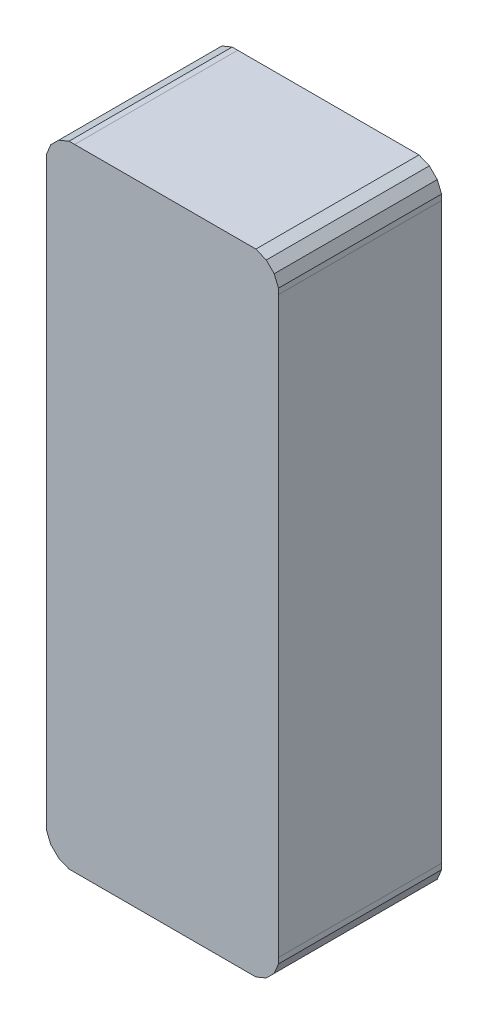
ISO-10303-21;
HEADER;
FILE_DESCRIPTION(('STEP AP214'),'2;1');
FILE_NAME('part.step','',(''),(''),'','','');
FILE_SCHEMA(('AUTOMOTIVE_DESIGN { 1 0 10303 214 1 1 1 1 }'));
ENDSEC;
DATA;
#1=APPLICATION_CONTEXT('core data for automotive mechanical design processes');
#2=APPLICATION_PROTOCOL_DEFINITION('international standard','automotive_design',2000,#1);
#3=PRODUCT_CONTEXT('',#1,'mechanical');
#4=PRODUCT('Part','Part','',(#3));
#5=PRODUCT_RELATED_PRODUCT_CATEGORY('part','',(#4));
#6=PRODUCT_DEFINITION_FORMATION('','',#4);
#7=PRODUCT_DEFINITION_CONTEXT('part definition',#1,'design');
#8=PRODUCT_DEFINITION('design','',#6,#7);
#9=PRODUCT_DEFINITION_SHAPE('','',#8);
#10=(LENGTH_UNIT() NAMED_UNIT(*) SI_UNIT(.MILLI.,.METRE.));
#11=(NAMED_UNIT(*) PLANE_ANGLE_UNIT() SI_UNIT($,.RADIAN.));
#12=(NAMED_UNIT(*) SI_UNIT($,.STERADIAN.) SOLID_ANGLE_UNIT());
#13=UNCERTAINTY_MEASURE_WITH_UNIT(LENGTH_MEASURE(1.E-05),#10,'distance_accuracy_value','');
#14=(GEOMETRIC_REPRESENTATION_CONTEXT(3) GLOBAL_UNCERTAINTY_ASSIGNED_CONTEXT((#13)) GLOBAL_UNIT_ASSIGNED_CONTEXT((#10,
#11,#12)) REPRESENTATION_CONTEXT('',''));
#15=CARTESIAN_POINT('',(0.,0.,0.));
#16=DIRECTION('',(0.,0.,1.));
#17=DIRECTION('',(1.,0.,0.));
#18=AXIS2_PLACEMENT_3D('',#15,#16,#17);
#19=CARTESIAN_POINT('',(24.229618583984,18.28157222,1.000000596046));
#20=DIRECTION('',(0.707106781187048,0.707106781186048,0.));
#21=DIRECTION('',(-0.707106781186048,0.707106781187048,0.));
#22=AXIS2_PLACEMENT_3D('',#19,#20,#21);
#23=PLANE('',#22);
#24=DIRECTION('',(0.,0.,1.));
#25=VECTOR('',#24,1.);
#26=CARTESIAN_POINT('',(24.356059783984,18.15513102,1.000000596046));
#27=LINE('',#26,#25);
#28=CARTESIAN_POINT('',(24.356059783984,18.15513102,1.000000596046));
#29=VERTEX_POINT('',#28);
#30=CARTESIAN_POINT('',(24.356059783984,18.15513102,3.600000476046));
#31=VERTEX_POINT('',#30);
#32=EDGE_CURVE('E180',#29,#31,#27,.T.);
#33=ORIENTED_EDGE('',*,*,#32,.F.);
#34=DIRECTION('',(-0.707106781186048,0.707106781187048,0.));
#35=VECTOR('',#34,1.);
#36=CARTESIAN_POINT('',(24.229618583984,18.28157222,1.000000596046));
#37=LINE('',#36,#35);
#38=CARTESIAN_POINT('',(24.229618583984,18.28157222,1.000000596046));
#39=VERTEX_POINT('',#38);
#40=EDGE_CURVE('E186',#29,#39,#37,.T.);
#41=ORIENTED_EDGE('',*,*,#40,.T.);
#42=DIRECTION('',(0.,0.,1.));
#43=VECTOR('',#42,1.);
#44=CARTESIAN_POINT('',(24.229618583984,18.28157222,1.000000596046));
#45=LINE('',#44,#43);
#46=CARTESIAN_POINT('',(24.229618583984,18.28157222,3.600000476046));
#47=VERTEX_POINT('',#46);
#48=EDGE_CURVE('E183',#47,#39,#45,.F.);
#49=ORIENTED_EDGE('',*,*,#48,.F.);
#50=DIRECTION('',(-0.707106781186048,0.707106781187048,0.));
#51=VECTOR('',#50,1.);
#52=CARTESIAN_POINT('',(24.229618583984,18.28157222,3.600000476046));
#53=LINE('',#52,#51);
#54=EDGE_CURVE('E177',#47,#31,#53,.F.);
#55=ORIENTED_EDGE('',*,*,#54,.T.);
#56=EDGE_LOOP('',(#33,#41,#49,#55));
#57=FACE_BOUND('',#56,.T.);
#58=ADVANCED_FACE('F17',(#57),#23,.T.);
#59=CARTESIAN_POINT('',(24.356184243984,8.4951986,1.000000596046));
#60=DIRECTION('',(0.707468684903795,-0.706744692148795,0.));
#61=DIRECTION('',(0.706744692148795,0.707468684903795,0.));
#62=AXIS2_PLACEMENT_3D('',#59,#60,#61);
#63=PLANE('',#62);
#64=DIRECTION('',(0.,0.,1.));
#65=VECTOR('',#64,1.);
#66=CARTESIAN_POINT('',(24.229730343984,8.36861516,1.000000596046));
#67=LINE('',#66,#65);
#68=CARTESIAN_POINT('',(24.229730343984,8.36861515999999,1.000000596046));
#69=VERTEX_POINT('',#68);
#70=CARTESIAN_POINT('',(24.229730343984,8.36861515999999,3.600000476046));
#71=VERTEX_POINT('',#70);
#72=EDGE_CURVE('E374',#69,#71,#67,.T.);
#73=ORIENTED_EDGE('',*,*,#72,.F.);
#74=DIRECTION('',(0.706744692148795,0.707468684903795,0.));
#75=VECTOR('',#74,1.);
#76=CARTESIAN_POINT('',(24.356184243984,8.4951986,1.000000596046));
#77=LINE('',#76,#75);
#78=CARTESIAN_POINT('',(24.356184243984,8.49519859999999,1.000000596046));
#79=VERTEX_POINT('',#78);
#80=EDGE_CURVE('E371',#69,#79,#77,.T.);
#81=ORIENTED_EDGE('',*,*,#80,.T.);
#82=DIRECTION('',(0.,0.,1.));
#83=VECTOR('',#82,1.);
#84=CARTESIAN_POINT('',(24.356184243984,8.49519859999998,1.000000596046));
#85=LINE('',#84,#83);
#86=CARTESIAN_POINT('',(24.356184243984,8.49519859999999,3.600000476046));
#87=VERTEX_POINT('',#86);
#88=EDGE_CURVE('E386',#87,#79,#85,.F.);
#89=ORIENTED_EDGE('',*,*,#88,.F.);
#90=DIRECTION('',(0.706744692148795,0.707468684903795,0.));
#91=VECTOR('',#90,1.);
#92=CARTESIAN_POINT('',(24.356184243984,8.4951986,3.600000476046));
#93=LINE('',#92,#91);
#94=EDGE_CURVE('E209',#87,#71,#93,.F.);
#95=ORIENTED_EDGE('',*,*,#94,.T.);
#96=EDGE_LOOP('',(#73,#81,#89,#95));
#97=FACE_BOUND('',#96,.T.);
#98=ADVANCED_FACE('F540',(#97),#63,.T.);
#99=CARTESIAN_POINT('',(20.920110343984,8.3685034,1.000000596046));
#100=DIRECTION('',(-0.707106781187048,-0.707106781186048,0.));
#101=DIRECTION('',(0.707106781186048,-0.707106781187048,0.));
#102=AXIS2_PLACEMENT_3D('',#99,#100,#101);
#103=PLANE('',#102);
#104=DIRECTION('',(0.,0.,1.));
#105=VECTOR('',#104,1.);
#106=CARTESIAN_POINT('',(20.793529443984,8.4950843,1.000000596046));
#107=LINE('',#106,#105);
#108=CARTESIAN_POINT('',(20.7935294439841,8.49508430000009,1.000000596046));
#109=VERTEX_POINT('',#108);
#110=CARTESIAN_POINT('',(20.793529443984,8.49508430000005,3.600000476046));
#111=VERTEX_POINT('',#110);
#112=EDGE_CURVE('E414',#109,#111,#107,.T.);
#113=ORIENTED_EDGE('',*,*,#112,.F.);
#114=DIRECTION('',(0.707106781186048,-0.707106781187048,0.));
#115=VECTOR('',#114,1.);
#116=CARTESIAN_POINT('',(20.920110343984,8.3685034,1.000000596046));
#117=LINE('',#116,#115);
#118=CARTESIAN_POINT('',(20.920110343984,8.36850339999999,1.000000596046));
#119=VERTEX_POINT('',#118);
#120=EDGE_CURVE('E364',#109,#119,#117,.T.);
#121=ORIENTED_EDGE('',*,*,#120,.T.);
#122=DIRECTION('',(0.,0.,1.));
#123=VECTOR('',#122,1.);
#124=CARTESIAN_POINT('',(20.920110343984,8.36850339999998,1.000000596046));
#125=LINE('',#124,#123);
#126=CARTESIAN_POINT('',(20.920110343984,8.36850339999999,3.600000476046));
#127=VERTEX_POINT('',#126);
#128=EDGE_CURVE('E358',#127,#119,#125,.F.);
#129=ORIENTED_EDGE('',*,*,#128,.F.);
#130=DIRECTION('',(0.707106781186048,-0.707106781187048,0.));
#131=VECTOR('',#130,1.);
#132=CARTESIAN_POINT('',(20.920110343984,8.3685034,3.600000476046));
#133=LINE('',#132,#131);
#134=EDGE_CURVE('E367',#127,#111,#133,.F.);
#135=ORIENTED_EDGE('',*,*,#134,.T.);
#136=EDGE_LOOP('',(#113,#121,#129,#135));
#137=FACE_BOUND('',#136,.T.);
#138=ADVANCED_FACE('F533',(#137),#103,.T.);
#139=CARTESIAN_POINT('',(20.793923143984,18.15509546,1.000000596046));
#140=DIRECTION('',(-0.707163595164945,0.707049962642945,0.));
#141=DIRECTION('',(-0.707049962642945,-0.707163595164945,0.));
#142=AXIS2_PLACEMENT_3D('',#139,#140,#141);
#143=PLANE('',#142);
#144=DIRECTION('',(0.,0.,1.));
#145=VECTOR('',#144,1.);
#146=CARTESIAN_POINT('',(20.920359263984,18.2815519,1.000000596046));
#147=LINE('',#146,#145);
#148=CARTESIAN_POINT('',(20.920359263984,18.2815519,1.000000596046));
#149=VERTEX_POINT('',#148);
#150=CARTESIAN_POINT('',(20.920359263984,18.2815519,3.600000476046));
#151=VERTEX_POINT('',#150);
#152=EDGE_CURVE('E255',#149,#151,#147,.T.);
#153=ORIENTED_EDGE('',*,*,#152,.F.);
#154=DIRECTION('',(-0.707049962642945,-0.707163595164945,0.));
#155=VECTOR('',#154,1.);
#156=CARTESIAN_POINT('',(20.793923143984,18.15509546,1.000000596046));
#157=LINE('',#156,#155);
#158=CARTESIAN_POINT('',(20.793923143984,18.15509546,1.000000596046));
#159=VERTEX_POINT('',#158);
#160=EDGE_CURVE('E879',#149,#159,#157,.T.);
#161=ORIENTED_EDGE('',*,*,#160,.T.);
#162=DIRECTION('',(0.,0.,1.));
#163=VECTOR('',#162,1.);
#164=CARTESIAN_POINT('',(20.7939231439839,18.15509546,1.000000596046));
#165=LINE('',#164,#163);
#166=CARTESIAN_POINT('',(20.7939231439839,18.15509546,3.600000476046));
#167=VERTEX_POINT('',#166);
#168=EDGE_CURVE('E433',#167,#159,#165,.F.);
#169=ORIENTED_EDGE('',*,*,#168,.F.);
#170=DIRECTION('',(-0.707049962642945,-0.707163595164945,0.));
#171=VECTOR('',#170,1.);
#172=CARTESIAN_POINT('',(20.793923143984,18.15509546,3.600000476046));
#173=LINE('',#172,#171);
#174=EDGE_CURVE('E366',#167,#151,#173,.F.);
#175=ORIENTED_EDGE('',*,*,#174,.T.);
#176=EDGE_LOOP('',(#153,#161,#169,#175));
#177=FACE_BOUND('',#176,.T.);
#178=ADVANCED_FACE('F526',(#177),#143,.T.);
#179=CARTESIAN_POINT('',(20.920359263984,18.2815519,1.000000596046));
#180=DIRECTION('',(-0.382745696709141,0.923853739317341,0.));
#181=DIRECTION('',(-0.923853739317341,-0.382745696709141,0.));
#182=AXIS2_PLACEMENT_3D('',#179,#180,#181);
#183=PLANE('',#182);
#184=DIRECTION('',(0.,0.,1.));
#185=VECTOR('',#184,1.);
#186=CARTESIAN_POINT('',(21.085563403984,18.34999474,1.000000596046));
#187=LINE('',#186,#185);
#188=CARTESIAN_POINT('',(21.085563403984,18.34999474,1.000000596046));
#189=VERTEX_POINT('',#188);
#190=CARTESIAN_POINT('',(21.085563403984,18.34999474,3.600000476046));
#191=VERTEX_POINT('',#190);
#192=EDGE_CURVE('E295',#189,#191,#187,.T.);
#193=ORIENTED_EDGE('',*,*,#192,.F.);
#194=DIRECTION('',(-0.923853739317341,-0.382745696709141,0.));
#195=VECTOR('',#194,1.);
#196=CARTESIAN_POINT('',(20.920359263984,18.2815519,1.000000596046));
#197=LINE('',#196,#195);
#198=EDGE_CURVE('E344',#189,#149,#197,.T.);
#199=ORIENTED_EDGE('',*,*,#198,.T.);
#200=ORIENTED_EDGE('',*,*,#152,.T.);
#201=DIRECTION('',(-0.923853739317341,-0.382745696709141,0.));
#202=VECTOR('',#201,1.);
#203=CARTESIAN_POINT('',(20.920359263984,18.2815519,3.600000476046));
#204=LINE('',#203,#202);
#205=EDGE_CURVE('E352',#151,#191,#204,.F.);
#206=ORIENTED_EDGE('',*,*,#205,.T.);
#207=EDGE_LOOP('',(#193,#199,#200,#206));
#208=FACE_BOUND('',#207,.T.);
#209=ADVANCED_FACE('F234',(#208),#183,.T.);
#210=CARTESIAN_POINT('',(24.064414443984,18.35000236,1.000000596046));
#211=DIRECTION('',(0.382685077513852,0.923878851066641,0.));
#212=DIRECTION('',(-0.923878851066641,0.382685077513852,0.));
#213=AXIS2_PLACEMENT_3D('',#210,#211,#212);
#214=PLANE('',#213);
#215=ORIENTED_EDGE('',*,*,#48,.T.);
#216=CARTESIAN_POINT('',(24.229618583984,18.28157222,1.000000596046));
#217=DIRECTION('',(-0.923878851066643,0.382685077513848,0.));
#218=VECTOR('',#217,1.);
#219=LINE('',#216,#218);
#220=CARTESIAN_POINT('',(24.0644175100198,18.35000109,1.000000596046));
#221=VERTEX_POINT('',#220);
#222=EDGE_CURVE('E200',#39,#221,#219,.T.);
#223=ORIENTED_EDGE('',*,*,#222,.T.);
#224=DIRECTION('',(0.,0.,1.));
#225=VECTOR('',#224,1.);
#226=CARTESIAN_POINT('',(24.064414443984,18.35000236,1.000000596046));
#227=LINE('',#226,#225);
#228=CARTESIAN_POINT('',(24.0644175100198,18.35000109,3.600000476046));
#229=VERTEX_POINT('',#228);
#230=EDGE_CURVE('E283',#229,#221,#227,.F.);
#231=ORIENTED_EDGE('',*,*,#230,.F.);
#232=CARTESIAN_POINT('',(24.064414443984,18.35000236,3.600000476046));
#233=DIRECTION('',(0.923878851066643,-0.382685077513848,0.));
#234=VECTOR('',#233,1.);
#235=LINE('',#232,#234);
#236=EDGE_CURVE('E250',#229,#47,#235,.T.);
#237=ORIENTED_EDGE('',*,*,#236,.T.);
#238=EDGE_LOOP('',(#215,#223,#231,#237));
#239=FACE_BOUND('',#238,.T.);
#240=ADVANCED_FACE('F224',(#239),#214,.T.);
#241=CARTESIAN_POINT('',(24.356059783984,18.15513102,1.000000596046));
#242=DIRECTION('',(0.923878851066641,0.382685077513852,0.));
#243=DIRECTION('',(-0.382685077513852,0.923878851066641,0.));
#244=AXIS2_PLACEMENT_3D('',#241,#242,#243);
#245=PLANE('',#244);
#246=DIRECTION('',(0.,0.,1.));
#247=VECTOR('',#246,1.);
#248=CARTESIAN_POINT('',(24.424489923984,17.98992688,1.000000596046));
#249=LINE('',#248,#247);
#250=CARTESIAN_POINT('',(24.424489923984,17.98992688,1.000000596046));
#251=VERTEX_POINT('',#250);
#252=CARTESIAN_POINT('',(24.424489923984,17.98992688,3.600000476046));
#253=VERTEX_POINT('',#252);
#254=EDGE_CURVE('E813',#251,#253,#249,.T.);
#255=ORIENTED_EDGE('',*,*,#254,.F.);
#256=DIRECTION('',(-0.382685077513852,0.923878851066641,0.));
#257=VECTOR('',#256,1.);
#258=CARTESIAN_POINT('',(24.356059783984,18.15513102,1.000000596046));
#259=LINE('',#258,#257);
#260=EDGE_CURVE('E197',#251,#29,#259,.T.);
#261=ORIENTED_EDGE('',*,*,#260,.T.);
#262=ORIENTED_EDGE('',*,*,#32,.T.);
#263=DIRECTION('',(-0.382685077513852,0.923878851066641,0.));
#264=VECTOR('',#263,1.);
#265=CARTESIAN_POINT('',(24.356059783984,18.15513102,3.600000476046));
#266=LINE('',#265,#264);
#267=EDGE_CURVE('E189',#31,#253,#266,.F.);
#268=ORIENTED_EDGE('',*,*,#267,.T.);
#269=EDGE_LOOP('',(#255,#261,#262,#268));
#270=FACE_BOUND('',#269,.T.);
#271=ADVANCED_FACE('F199',(#270),#245,.T.);
#272=CARTESIAN_POINT('',(24.424568663984,8.66054244,1.000000596046));
#273=DIRECTION('',(0.924083401297023,-0.38219087828901,0.));
#274=DIRECTION('',(0.38219087828901,0.924083401297023,0.));
#275=AXIS2_PLACEMENT_3D('',#272,#273,#274);
#276=PLANE('',#275);
#277=ORIENTED_EDGE('',*,*,#88,.T.);
#278=DIRECTION('',(0.38219087828901,0.924083401297023,0.));
#279=VECTOR('',#278,1.);
#280=CARTESIAN_POINT('',(24.424568663984,8.66054244,1.000000596046));
#281=LINE('',#280,#279);
#282=CARTESIAN_POINT('',(24.424568663984,8.66054244,1.000000596046));
#283=VERTEX_POINT('',#282);
#284=EDGE_CURVE('E378',#79,#283,#281,.T.);
#285=ORIENTED_EDGE('',*,*,#284,.T.);
#286=DIRECTION('',(0.,0.,1.));
#287=VECTOR('',#286,1.);
#288=CARTESIAN_POINT('',(24.424568663984,8.66054244,1.000000596046));
#289=LINE('',#288,#287);
#290=CARTESIAN_POINT('',(24.424568663984,8.66054244,3.600000476046));
#291=VERTEX_POINT('',#290);
#292=EDGE_CURVE('E775',#291,#283,#289,.F.);
#293=ORIENTED_EDGE('',*,*,#292,.F.);
#294=DIRECTION('',(0.38219087828901,0.924083401297023,0.));
#295=VECTOR('',#294,1.);
#296=CARTESIAN_POINT('',(24.424568663984,8.66054244,3.600000476046));
#297=LINE('',#296,#295);
#298=EDGE_CURVE('E388',#291,#87,#297,.F.);
#299=ORIENTED_EDGE('',*,*,#298,.T.);
#300=EDGE_LOOP('',(#277,#285,#293,#299));
#301=FACE_BOUND('',#300,.T.);
#302=ADVANCED_FACE('F505',(#301),#276,.T.);
#303=CARTESIAN_POINT('',(24.229730343984,8.36861516,1.000000596046));
#304=DIRECTION('',(0.38314826593391,-0.923686855114783,0.));
#305=DIRECTION('',(0.923686855114783,0.38314826593391,0.));
#306=AXIS2_PLACEMENT_3D('',#303,#304,#305);
#307=PLANE('',#306);
#308=DIRECTION('',(0.,0.,1.));
#309=VECTOR('',#308,1.);
#310=CARTESIAN_POINT('',(24.064460163984,8.30006056,1.000000596046));
#311=LINE('',#310,#309);
#312=CARTESIAN_POINT('',(24.064460163984,8.30006056000002,1.000000596046));
#313=VERTEX_POINT('',#312);
#314=CARTESIAN_POINT('',(24.064460163984,8.30006056000002,3.600000476046));
#315=VERTEX_POINT('',#314);
#316=EDGE_CURVE('E770',#313,#315,#311,.T.);
#317=ORIENTED_EDGE('',*,*,#316,.F.);
#318=DIRECTION('',(0.923686855114783,0.38314826593391,0.));
#319=VECTOR('',#318,1.);
#320=CARTESIAN_POINT('',(24.229730343984,8.36861516,1.000000596046));
#321=LINE('',#320,#319);
#322=EDGE_CURVE('E407',#313,#69,#321,.T.);
#323=ORIENTED_EDGE('',*,*,#322,.T.);
#324=ORIENTED_EDGE('',*,*,#72,.T.);
#325=DIRECTION('',(0.923686855114783,0.38314826593391,0.));
#326=VECTOR('',#325,1.);
#327=CARTESIAN_POINT('',(24.229730343984,8.36861516,3.600000476046));
#328=LINE('',#327,#326);
#329=EDGE_CURVE('E377',#71,#315,#328,.F.);
#330=ORIENTED_EDGE('',*,*,#329,.T.);
#331=EDGE_LOOP('',(#317,#323,#324,#330));
#332=FACE_BOUND('',#331,.T.);
#333=ADVANCED_FACE('F503',(#332),#307,.T.);
#334=CARTESIAN_POINT('',(21.085499903984,8.30000214,1.000000596046));
#335=DIRECTION('',(-0.382657976302852,-0.923890076346643,0.));
#336=DIRECTION('',(0.923890076346643,-0.382657976302852,0.));
#337=AXIS2_PLACEMENT_3D('',#334,#335,#336);
#338=PLANE('',#337);
#339=ORIENTED_EDGE('',*,*,#128,.T.);
#340=DIRECTION('',(0.923890076346643,-0.382657976302852,0.));
#341=VECTOR('',#340,1.);
#342=CARTESIAN_POINT('',(21.085499903984,8.30000214,1.000000596046));
#343=LINE('',#342,#341);
#344=CARTESIAN_POINT('',(21.085499903984,8.30000340999997,1.000000596046));
#345=VERTEX_POINT('',#344);
#346=EDGE_CURVE('E361',#119,#345,#343,.T.);
#347=ORIENTED_EDGE('',*,*,#346,.T.);
#348=DIRECTION('',(0.,0.,1.));
#349=VECTOR('',#348,1.);
#350=CARTESIAN_POINT('',(21.085499903984,8.30000213999995,1.000000596046));
#351=LINE('',#350,#349);
#352=CARTESIAN_POINT('',(21.085499903984,8.30000340999997,3.600000476046));
#353=VERTEX_POINT('',#352);
#354=EDGE_CURVE('E769',#353,#345,#351,.F.);
#355=ORIENTED_EDGE('',*,*,#354,.F.);
#356=DIRECTION('',(0.923890076346643,-0.382657976302852,0.));
#357=VECTOR('',#356,1.);
#358=CARTESIAN_POINT('',(21.085499903984,8.30000214,3.600000476046));
#359=LINE('',#358,#357);
#360=EDGE_CURVE('E323',#353,#127,#359,.F.);
#361=ORIENTED_EDGE('',*,*,#360,.T.);
#362=EDGE_LOOP('',(#339,#347,#355,#361));
#363=FACE_BOUND('',#362,.T.);
#364=ADVANCED_FACE('F500',(#363),#338,.T.);
#365=CARTESIAN_POINT('',(20.793529443984,8.4950843,1.000000596046));
#366=DIRECTION('',(-0.923890076346643,-0.382657976302852,0.));
#367=DIRECTION('',(0.382657976302852,-0.923890076346643,0.));
#368=AXIS2_PLACEMENT_3D('',#365,#366,#367);
#369=PLANE('',#368);
#370=DIRECTION('',(0.,0.,1.));
#371=VECTOR('',#370,1.);
#372=CARTESIAN_POINT('',(20.725028183984,8.66047386,1.000000596046));
#373=LINE('',#372,#371);
#374=CARTESIAN_POINT('',(20.725028183984,8.66047386,1.000000596046));
#375=VERTEX_POINT('',#374);
#376=CARTESIAN_POINT('',(20.725028183984,8.66047386,3.600000476046));
#377=VERTEX_POINT('',#376);
#378=EDGE_CURVE('E733',#375,#377,#373,.T.);
#379=ORIENTED_EDGE('',*,*,#378,.F.);
#380=DIRECTION('',(0.382657976302852,-0.923890076346643,0.));
#381=VECTOR('',#380,1.);
#382=CARTESIAN_POINT('',(20.793529443984,8.4950843,1.000000596046));
#383=LINE('',#382,#381);
#384=EDGE_CURVE('E424',#375,#109,#383,.T.);
#385=ORIENTED_EDGE('',*,*,#384,.T.);
#386=ORIENTED_EDGE('',*,*,#112,.T.);
#387=DIRECTION('',(0.382657976302852,-0.923890076346643,0.));
#388=VECTOR('',#387,1.);
#389=CARTESIAN_POINT('',(20.793529443984,8.4950843,3.600000476046));
#390=LINE('',#389,#388);
#391=EDGE_CURVE('E419',#111,#377,#390,.F.);
#392=ORIENTED_EDGE('',*,*,#391,.T.);
#393=EDGE_LOOP('',(#379,#385,#386,#392));
#394=FACE_BOUND('',#393,.T.);
#395=ADVANCED_FACE('F496',(#394),#369,.T.);
#396=CARTESIAN_POINT('',(20.725508243984,17.98987862,1.000000596046));
#397=DIRECTION('',(-0.923919378216814,0.382587222153923,0.));
#398=DIRECTION('',(-0.382587222153923,-0.923919378216814,0.));
#399=AXIS2_PLACEMENT_3D('',#396,#397,#398);
#400=PLANE('',#399);
#401=ORIENTED_EDGE('',*,*,#168,.T.);
#402=DIRECTION('',(-0.382587222153923,-0.923919378216814,0.));
#403=VECTOR('',#402,1.);
#404=CARTESIAN_POINT('',(20.725508243984,17.98987862,1.000000596046));
#405=LINE('',#404,#403);
#406=CARTESIAN_POINT('',(20.725508243984,17.98987862,1.000000596046));
#407=VERTEX_POINT('',#406);
#408=EDGE_CURVE('E298',#159,#407,#405,.T.);
#409=ORIENTED_EDGE('',*,*,#408,.T.);
#410=DIRECTION('',(0.,0.,1.));
#411=VECTOR('',#410,1.);
#412=CARTESIAN_POINT('',(20.725508243984,17.98987862,1.000000596046));
#413=LINE('',#412,#411);
#414=CARTESIAN_POINT('',(20.725508243984,17.98987862,3.600000476046));
#415=VERTEX_POINT('',#414);
#416=EDGE_CURVE('E706',#415,#407,#413,.F.);
#417=ORIENTED_EDGE('',*,*,#416,.F.);
#418=DIRECTION('',(0.38258722215453,0.923919378216563,0.));
#419=VECTOR('',#418,1.);
#420=CARTESIAN_POINT('',(20.725508243984,17.98987862,3.600000476046));
#421=LINE('',#420,#419);
#422=EDGE_CURVE('E729',#415,#167,#421,.T.);
#423=ORIENTED_EDGE('',*,*,#422,.T.);
#424=EDGE_LOOP('',(#401,#409,#417,#423));
#425=FACE_BOUND('',#424,.T.);
#426=ADVANCED_FACE('F491',(#425),#400,.T.);
#427=CARTESIAN_POINT('',(21.085563403984,18.34999474,1.000000596046));
#428=DIRECTION('',(-2.8407476802846E-05,0.999999999596508,0.));
#429=DIRECTION('',(-0.999999999596508,-2.8407476802846E-05,0.));
#430=AXIS2_PLACEMENT_3D('',#427,#428,#429);
#431=PLANE('',#430);
#432=CARTESIAN_POINT('',(21.175009503984,18.35000236,1.000000596046));
#433=DIRECTION('',(0.,0.,1.));
#434=VECTOR('',#433,1.);
#435=LINE('',#432,#434);
#436=CARTESIAN_POINT('',(21.174992993984,18.34999982,1.000000596046));
#437=VERTEX_POINT('',#436);
#438=CARTESIAN_POINT('',(21.174992993984,18.34999982,3.600000476046));
#439=VERTEX_POINT('',#438);
#440=EDGE_CURVE('E474',#437,#439,#435,.T.);
#441=ORIENTED_EDGE('',*,*,#440,.F.);
#442=DIRECTION('',(-0.999999999596508,-2.8407476802846E-05,0.));
#443=VECTOR('',#442,1.);
#444=CARTESIAN_POINT('',(21.085563403984,18.34999474,1.000000596046));
#445=LINE('',#444,#443);
#446=EDGE_CURVE('E292',#437,#189,#445,.T.);
#447=ORIENTED_EDGE('',*,*,#446,.T.);
#448=ORIENTED_EDGE('',*,*,#192,.T.);
#449=DIRECTION('',(-1.,0.,0.));
#450=VECTOR('',#449,1.);
#451=CARTESIAN_POINT('',(22.574904094068,18.34999474,3.600000476046));
#452=LINE('',#451,#450);
#453=EDGE_CURVE('E727',#191,#439,#452,.F.);
#454=ORIENTED_EDGE('',*,*,#453,.T.);
#455=EDGE_LOOP('',(#441,#447,#448,#454));
#456=FACE_BOUND('',#455,.T.);
#457=ADVANCED_FACE('F480',(#456),#431,.T.);
#458=CARTESIAN_POINT('',(24.424489923984,17.98992688,1.000000596046));
#459=DIRECTION('',(0.999999999596462,-2.84090905461731E-05,0.));
#460=DIRECTION('',(2.84090905461731E-05,0.999999999596462,0.));
#461=AXIS2_PLACEMENT_3D('',#458,#459,#460);
#462=PLANE('',#461);
#463=CARTESIAN_POINT('',(24.424522943984,17.9004884,1.000000596046));
#464=DIRECTION('',(0.,0.,1.));
#465=VECTOR('',#464,1.);
#466=LINE('',#463,#465);
#467=CARTESIAN_POINT('',(24.424505163984,17.90050364,1.000000596046));
#468=VERTEX_POINT('',#467);
#469=CARTESIAN_POINT('',(24.424505163984,17.90050364,3.600000476046));
#470=VERTEX_POINT('',#469);
#471=EDGE_CURVE('E782',#468,#470,#466,.T.);
#472=ORIENTED_EDGE('',*,*,#471,.F.);
#473=DIRECTION('',(2.84090905461731E-05,0.999999999596462,0.));
#474=VECTOR('',#473,1.);
#475=CARTESIAN_POINT('',(24.424489923984,17.98992688,1.000000596046));
#476=LINE('',#475,#474);
#477=EDGE_CURVE('E806',#468,#251,#476,.T.);
#478=ORIENTED_EDGE('',*,*,#477,.T.);
#479=ORIENTED_EDGE('',*,*,#254,.T.);
#480=DIRECTION('',(0.,1.,0.));
#481=VECTOR('',#480,1.);
#482=CARTESIAN_POINT('',(24.424489923984,13.324963151245,3.600000476046));
#483=LINE('',#482,#481);
#484=EDGE_CURVE('E193',#253,#470,#483,.F.);
#485=ORIENTED_EDGE('',*,*,#484,.T.);
#486=EDGE_LOOP('',(#472,#478,#479,#485));
#487=FACE_BOUND('',#486,.T.);
#488=ADVANCED_FACE('F490',(#487),#462,.T.);
#489=CARTESIAN_POINT('',(24.424517863984,8.75000378,1.000000596046));
#490=DIRECTION('',(0.999999838777175,0.0005678429565969,0.));
#491=DIRECTION('',(-0.0005678429565969,0.999999838777175,0.));
#492=AXIS2_PLACEMENT_3D('',#489,#490,#491);
#493=PLANE('',#492);
#494=ORIENTED_EDGE('',*,*,#292,.T.);
#495=DIRECTION('',(-0.0005678429565969,0.999999838777175,0.));
#496=VECTOR('',#495,1.);
#497=CARTESIAN_POINT('',(24.424517863984,8.75000378,1.000000596046));
#498=LINE('',#497,#496);
#499=CARTESIAN_POINT('',(24.424518371984,8.75000378,1.000000596046));
#500=VERTEX_POINT('',#499);
#501=EDGE_CURVE('E773',#283,#500,#498,.T.);
#502=ORIENTED_EDGE('',*,*,#501,.T.);
#503=DIRECTION('',(0.,0.,1.));
#504=VECTOR('',#503,1.);
#505=CARTESIAN_POINT('',(24.424517863984,8.75000378,1.000000596046));
#506=LINE('',#505,#504);
#507=CARTESIAN_POINT('',(24.4245178639842,8.75000377971153,3.600000476046));
#508=VERTEX_POINT('',#507);
#509=EDGE_CURVE('E781',#508,#500,#506,.F.);
#510=ORIENTED_EDGE('',*,*,#509,.F.);
#511=DIRECTION('',(0.000567842956612566,-0.999999838777175,0.));
#512=VECTOR('',#511,1.);
#513=CARTESIAN_POINT('',(24.424517863984,8.75000378,3.600000476046));
#514=LINE('',#513,#512);
#515=EDGE_CURVE('E720',#508,#291,#514,.T.);
#516=ORIENTED_EDGE('',*,*,#515,.T.);
#517=EDGE_LOOP('',(#494,#502,#510,#516));
#518=FACE_BOUND('',#517,.T.);
#519=ADVANCED_FACE('F609',(#518),#493,.T.);
#520=CARTESIAN_POINT('',(24.064460163984,8.30006056,1.000000596046));
#521=DIRECTION('',(0.00045426149431181,-0.999999896823242,0.));
#522=DIRECTION('',(0.999999896823242,0.00045426149431181,0.));
#523=AXIS2_PLACEMENT_3D('',#520,#521,#522);
#524=PLANE('',#523);
#525=CARTESIAN_POINT('',(23.975008983984,8.30000468,1.000000596046));
#526=DIRECTION('',(0.,0.,1.));
#527=VECTOR('',#526,1.);
#528=LINE('',#525,#527);
#529=CARTESIAN_POINT('',(23.975002633984,8.30001229999999,1.000000596046));
#530=VERTEX_POINT('',#529);
#531=CARTESIAN_POINT('',(23.975002633984,8.3000123,3.600000476046));
#532=VERTEX_POINT('',#531);
#533=EDGE_CURVE('E740',#530,#532,#528,.T.);
#534=ORIENTED_EDGE('',*,*,#533,.F.);
#535=DIRECTION('',(0.999999896823242,0.00045426149431181,0.));
#536=VECTOR('',#535,1.);
#537=CARTESIAN_POINT('',(24.064460163984,8.30006056,1.000000596046));
#538=LINE('',#537,#536);
#539=EDGE_CURVE('E761',#530,#313,#538,.T.);
#540=ORIENTED_EDGE('',*,*,#539,.T.);
#541=ORIENTED_EDGE('',*,*,#316,.T.);
#542=DIRECTION('',(-0.999999896823242,-0.000454261494220596,0.));
#543=VECTOR('',#542,1.);
#544=CARTESIAN_POINT('',(24.064460163984,8.30006056,3.600000476046));
#545=LINE('',#544,#543);
#546=EDGE_CURVE('E718',#315,#532,#545,.T.);
#547=ORIENTED_EDGE('',*,*,#546,.T.);
#548=EDGE_LOOP('',(#534,#540,#541,#547));
#549=FACE_BOUND('',#548,.T.);
#550=ADVANCED_FACE('F617',(#549),#524,.T.);
#551=CARTESIAN_POINT('',(21.175006963984,8.30000722,1.000000596046));
#552=DIRECTION('',(5.67553000027037E-05,-0.999999998389418,0.));
#553=DIRECTION('',(0.999999998389418,5.67553000027037E-05,0.));
#554=AXIS2_PLACEMENT_3D('',#551,#552,#553);
#555=PLANE('',#554);
#556=ORIENTED_EDGE('',*,*,#354,.T.);
#557=CARTESIAN_POINT('',(21.085499903984,8.30000213999995,1.000000596046));
#558=DIRECTION('',(0.999999998389418,5.67553000025181E-05,0.));
#559=VECTOR('',#558,1.);
#560=LINE('',#557,#559);
#561=CARTESIAN_POINT('',(21.175006963984,8.30000722000001,1.000000596046));
#562=VERTEX_POINT('',#561);
#563=EDGE_CURVE('E306',#345,#562,#560,.T.);
#564=ORIENTED_EDGE('',*,*,#563,.T.);
#565=DIRECTION('',(0.,0.,1.));
#566=VECTOR('',#565,1.);
#567=CARTESIAN_POINT('',(21.175006963984,8.30000722000003,1.000000596046));
#568=LINE('',#567,#566);
#569=CARTESIAN_POINT('',(21.175006963984,8.30000722000001,3.600000476046));
#570=VERTEX_POINT('',#569);
#571=EDGE_CURVE('E739',#570,#562,#568,.F.);
#572=ORIENTED_EDGE('',*,*,#571,.F.);
#573=CARTESIAN_POINT('',(21.175006963984,8.30000722,3.600000476046));
#574=DIRECTION('',(-0.999999998389418,-5.67553000025181E-05,0.));
#575=VECTOR('',#574,1.);
#576=LINE('',#573,#575);
#577=EDGE_CURVE('E717',#570,#353,#576,.T.);
#578=ORIENTED_EDGE('',*,*,#577,.T.);
#579=EDGE_LOOP('',(#556,#564,#572,#578));
#580=FACE_BOUND('',#579,.T.);
#581=ADVANCED_FACE('F267',(#580),#555,.T.);
#582=CARTESIAN_POINT('',(22.574904094068,13.324963151245,3.600000476046));
#583=DIRECTION('',(0.,0.,-1.));
#584=DIRECTION('',(-1.,0.,0.));
#585=AXIS2_PLACEMENT_3D('',#582,#583,#584);
#586=PLANE('',#585);
#587=DIRECTION('',(0.,1.,0.));
#588=VECTOR('',#587,1.);
#589=CARTESIAN_POINT('',(20.725028183984,13.324963151245,3.600000476046));
#590=LINE('',#589,#588);
#591=CARTESIAN_POINT('',(20.725032882984,8.74998092,3.600000476046));
#592=VERTEX_POINT('',#591);
#593=EDGE_CURVE('E712',#377,#592,#590,.T.);
#594=ORIENTED_EDGE('',*,*,#593,.F.);
#595=ORIENTED_EDGE('',*,*,#391,.F.);
#596=ORIENTED_EDGE('',*,*,#134,.F.);
#597=ORIENTED_EDGE('',*,*,#360,.F.);
#598=ORIENTED_EDGE('',*,*,#577,.F.);
#599=DIRECTION('',(0.999999999999589,-9.07142211781727E-07,0.));
#600=VECTOR('',#599,1.);
#601=CARTESIAN_POINT('',(23.975008983984,8.30000468,3.600000476046));
#602=LINE('',#601,#600);
#603=EDGE_CURVE('E736',#532,#570,#602,.F.);
#604=ORIENTED_EDGE('',*,*,#603,.F.);
#605=ORIENTED_EDGE('',*,*,#546,.F.);
#606=ORIENTED_EDGE('',*,*,#329,.F.);
#607=ORIENTED_EDGE('',*,*,#94,.F.);
#608=ORIENTED_EDGE('',*,*,#298,.F.);
#609=ORIENTED_EDGE('',*,*,#515,.F.);
#610=DIRECTION('',(5.55161852618115E-07,0.999999999999846,0.));
#611=VECTOR('',#610,1.);
#612=CARTESIAN_POINT('',(24.424522943984,17.9004884,3.600000476046));
#613=LINE('',#612,#611);
#614=EDGE_CURVE('E778',#470,#508,#613,.F.);
#615=ORIENTED_EDGE('',*,*,#614,.F.);
#616=ORIENTED_EDGE('',*,*,#484,.F.);
#617=ORIENTED_EDGE('',*,*,#267,.F.);
#618=ORIENTED_EDGE('',*,*,#54,.F.);
#619=ORIENTED_EDGE('',*,*,#236,.F.);
#620=CARTESIAN_POINT('',(23.975008983984,18.34999982,3.600000476046));
#621=DIRECTION('',(0.999999999999589,-9.07143037486263E-07,0.));
#622=VECTOR('',#621,1.);
#623=LINE('',#620,#622);
#624=CARTESIAN_POINT('',(23.975008983984,18.34999982,3.600000476046));
#625=VERTEX_POINT('',#624);
#626=EDGE_CURVE('E724',#625,#229,#623,.T.);
#627=ORIENTED_EDGE('',*,*,#626,.F.);
#628=DIRECTION('',(-0.999999999999589,9.07143014388227E-07,0.));
#629=VECTOR('',#628,1.);
#630=CARTESIAN_POINT('',(21.175009503984,18.35000236,3.600000476046));
#631=LINE('',#630,#629);
#632=EDGE_CURVE('E816',#439,#625,#631,.F.);
#633=ORIENTED_EDGE('',*,*,#632,.F.);
#634=ORIENTED_EDGE('',*,*,#453,.F.);
#635=ORIENTED_EDGE('',*,*,#205,.F.);
#636=ORIENTED_EDGE('',*,*,#174,.F.);
#637=ORIENTED_EDGE('',*,*,#422,.F.);
#638=DIRECTION('',(0.000113629906523814,-0.999999993544122,0.));
#639=VECTOR('',#638,1.);
#640=CARTESIAN_POINT('',(20.725518403984,17.90046554,3.600000476046));
#641=LINE('',#640,#639);
#642=CARTESIAN_POINT('',(20.725518403984,17.90046554,3.600000476046));
#643=VERTEX_POINT('',#642);
#644=EDGE_CURVE('E709',#643,#415,#641,.F.);
#645=ORIENTED_EDGE('',*,*,#644,.F.);
#646=DIRECTION('',(-5.30179569157261E-05,-0.999999998594548,0.));
#647=VECTOR('',#646,1.);
#648=CARTESIAN_POINT('',(20.725033263984,8.74998092,3.600000476046));
#649=LINE('',#648,#647);
#650=EDGE_CURVE('E697',#592,#643,#649,.F.);
#651=ORIENTED_EDGE('',*,*,#650,.F.);
#652=EDGE_LOOP('',(#594,#595,#596,#597,#598,#604,#605,#606,#607,#608,#609,#615,#616,#617,#618,
#619,#627,#633,#634,#635,#636,#637,#645,#651));
#653=FACE_BOUND('',#652,.T.);
#654=ADVANCED_FACE('F191',(#653),#586,.F.);
#655=CARTESIAN_POINT('',(20.725518403984,17.90046554,1.000000596046));
#656=DIRECTION('',(-0.999999993544122,-0.000113629906523814,0.));
#657=DIRECTION('',(0.000113629906523814,-0.999999993544122,0.));
#658=AXIS2_PLACEMENT_3D('',#655,#656,#657);
#659=PLANE('',#658);
#660=ORIENTED_EDGE('',*,*,#416,.T.);
#661=DIRECTION('',(0.000113629906523814,-0.999999993544122,0.));
#662=VECTOR('',#661,1.);
#663=CARTESIAN_POINT('',(20.725518403984,17.90046554,1.000000596046));
#664=LINE('',#663,#662);
#665=CARTESIAN_POINT('',(20.725518403984,17.90046554,1.000000596046));
#666=VERTEX_POINT('',#665);
#667=EDGE_CURVE('E703',#407,#666,#664,.T.);
#668=ORIENTED_EDGE('',*,*,#667,.T.);
#669=DIRECTION('',(0.,0.,1.));
#670=VECTOR('',#669,1.);
#671=CARTESIAN_POINT('',(20.725518403984,17.90046554,1.000000596046));
#672=LINE('',#671,#670);
#673=EDGE_CURVE('E695',#643,#666,#672,.F.);
#674=ORIENTED_EDGE('',*,*,#673,.F.);
#675=ORIENTED_EDGE('',*,*,#644,.T.);
#676=EDGE_LOOP('',(#660,#668,#674,#675));
#677=FACE_BOUND('',#676,.T.);
#678=ADVANCED_FACE('F266',(#677),#659,.T.);
#679=CARTESIAN_POINT('',(21.175009503984,18.35000236,1.000000596046));
#680=DIRECTION('',(9.07143014388227E-07,0.999999999999589,0.));
#681=DIRECTION('',(-0.999999999999589,9.07143014388227E-07,0.));
#682=AXIS2_PLACEMENT_3D('',#679,#680,#681);
#683=PLANE('',#682);
#684=ORIENTED_EDGE('',*,*,#632,.T.);
#685=ORIENTED_EDGE('',*,*,#626,.T.);
#686=ORIENTED_EDGE('',*,*,#230,.T.);
#687=CARTESIAN_POINT('',(24.0644144439816,18.3499997388965,1.000000596046));
#688=DIRECTION('',(-0.999999999999589,9.07143037486263E-07,0.));
#689=VECTOR('',#688,1.);
#690=LINE('',#687,#689);
#691=CARTESIAN_POINT('',(23.975008983984,18.34999982,1.000000596046));
#692=VERTEX_POINT('',#691);
#693=EDGE_CURVE('E291',#221,#692,#690,.T.);
#694=ORIENTED_EDGE('',*,*,#693,.T.);
#695=DIRECTION('',(-1.,0.,0.));
#696=VECTOR('',#695,1.);
#697=CARTESIAN_POINT('',(22.574904094068,18.35000236,1.000000596046));
#698=LINE('',#697,#696);
#699=EDGE_CURVE('E699',#437,#692,#698,.F.);
#700=ORIENTED_EDGE('',*,*,#699,.F.);
#701=ORIENTED_EDGE('',*,*,#440,.T.);
#702=EDGE_LOOP('',(#684,#685,#686,#694,#700,#701));
#703=FACE_BOUND('',#702,.T.);
#704=ADVANCED_FACE('F445',(#703),#683,.T.);
#705=CARTESIAN_POINT('',(24.424522943984,17.9004884,1.000000596046));
#706=DIRECTION('',(0.999999999999846,-5.55161852618115E-07,0.));
#707=DIRECTION('',(5.55161852618115E-07,0.999999999999846,0.));
#708=AXIS2_PLACEMENT_3D('',#705,#706,#707);
#709=PLANE('',#708);
#710=ORIENTED_EDGE('',*,*,#509,.T.);
#711=DIRECTION('',(0.,1.,0.));
#712=VECTOR('',#711,1.);
#713=CARTESIAN_POINT('',(24.424522943984,13.324963151245,1.000000596046));
#714=LINE('',#713,#712);
#715=EDGE_CURVE('E820',#468,#500,#714,.F.);
#716=ORIENTED_EDGE('',*,*,#715,.F.);
#717=ORIENTED_EDGE('',*,*,#471,.T.);
#718=ORIENTED_EDGE('',*,*,#614,.T.);
#719=EDGE_LOOP('',(#710,#716,#717,#718));
#720=FACE_BOUND('',#719,.T.);
#721=ADVANCED_FACE('F454',(#720),#709,.T.);
#722=CARTESIAN_POINT('',(23.975008983984,8.30000468,1.000000596046));
#723=DIRECTION('',(-9.07142211781727E-07,-0.999999999999589,0.));
#724=DIRECTION('',(0.999999999999589,-9.07142211781727E-07,0.));
#725=AXIS2_PLACEMENT_3D('',#722,#723,#724);
#726=PLANE('',#725);
#727=ORIENTED_EDGE('',*,*,#571,.T.);
#728=DIRECTION('',(-1.,0.,0.));
#729=VECTOR('',#728,1.);
#730=CARTESIAN_POINT('',(22.574904094068,8.30000468,1.000000596046));
#731=LINE('',#730,#729);
#732=EDGE_CURVE('E28',#530,#562,#731,.T.);
#733=ORIENTED_EDGE('',*,*,#732,.F.);
#734=ORIENTED_EDGE('',*,*,#533,.T.);
#735=ORIENTED_EDGE('',*,*,#603,.T.);
#736=EDGE_LOOP('',(#727,#733,#734,#735));
#737=FACE_BOUND('',#736,.T.);
#738=ADVANCED_FACE('F655',(#737),#726,.T.);
#739=CARTESIAN_POINT('',(20.725033263984,8.74998092,1.000000596046));
#740=DIRECTION('',(-0.999999998594548,5.30179569157261E-05,0.));
#741=DIRECTION('',(-5.30179569157261E-05,-0.999999998594548,0.));
#742=AXIS2_PLACEMENT_3D('',#739,#740,#741);
#743=PLANE('',#742);
#744=ORIENTED_EDGE('',*,*,#673,.T.);
#745=DIRECTION('',(5.30179569134985E-05,0.999999998594548,0.));
#746=VECTOR('',#745,1.);
#747=CARTESIAN_POINT('',(20.725033263984,8.74998092,1.000000596046));
#748=LINE('',#747,#746);
#749=CARTESIAN_POINT('',(20.725032882984,8.74998092,1.000000596046));
#750=VERTEX_POINT('',#749);
#751=EDGE_CURVE('E11',#750,#666,#748,.T.);
#752=ORIENTED_EDGE('',*,*,#751,.F.);
#753=DIRECTION('',(-5.67552987325937E-05,-0.999999998389418,0.));
#754=VECTOR('',#753,1.);
#755=CARTESIAN_POINT('',(20.725028183984,8.66047386,1.000000596046));
#756=LINE('',#755,#754);
#757=EDGE_CURVE('E36',#750,#375,#756,.T.);
#758=ORIENTED_EDGE('',*,*,#757,.T.);
#759=ORIENTED_EDGE('',*,*,#378,.T.);
#760=ORIENTED_EDGE('',*,*,#593,.T.);
#761=ORIENTED_EDGE('',*,*,#650,.T.);
#762=EDGE_LOOP('',(#744,#752,#758,#759,#760,#761));
#763=FACE_BOUND('',#762,.T.);
#764=ADVANCED_FACE('F334',(#763),#743,.T.);
#765=CARTESIAN_POINT('',(22.574904094068,13.324963151245,1.000000596046));
#766=DIRECTION('',(0.,0.,-1.));
#767=DIRECTION('',(-1.,0.,0.));
#768=AXIS2_PLACEMENT_3D('',#765,#766,#767);
#769=PLANE('',#768);
#770=ORIENTED_EDGE('',*,*,#757,.F.);
#771=ORIENTED_EDGE('',*,*,#751,.T.);
#772=ORIENTED_EDGE('',*,*,#667,.F.);
#773=ORIENTED_EDGE('',*,*,#408,.F.);
#774=ORIENTED_EDGE('',*,*,#160,.F.);
#775=ORIENTED_EDGE('',*,*,#198,.F.);
#776=ORIENTED_EDGE('',*,*,#446,.F.);
#777=ORIENTED_EDGE('',*,*,#699,.T.);
#778=ORIENTED_EDGE('',*,*,#693,.F.);
#779=ORIENTED_EDGE('',*,*,#222,.F.);
#780=ORIENTED_EDGE('',*,*,#40,.F.);
#781=ORIENTED_EDGE('',*,*,#260,.F.);
#782=ORIENTED_EDGE('',*,*,#477,.F.);
#783=ORIENTED_EDGE('',*,*,#715,.T.);
#784=ORIENTED_EDGE('',*,*,#501,.F.);
#785=ORIENTED_EDGE('',*,*,#284,.F.);
#786=ORIENTED_EDGE('',*,*,#80,.F.);
#787=ORIENTED_EDGE('',*,*,#322,.F.);
#788=ORIENTED_EDGE('',*,*,#539,.F.);
#789=ORIENTED_EDGE('',*,*,#732,.T.);
#790=ORIENTED_EDGE('',*,*,#563,.F.);
#791=ORIENTED_EDGE('',*,*,#346,.F.);
#792=ORIENTED_EDGE('',*,*,#120,.F.);
#793=ORIENTED_EDGE('',*,*,#384,.F.);
#794=EDGE_LOOP('',(#770,#771,#772,#773,#774,#775,#776,#777,#778,#779,#780,#781,#782,#783,#784,
#785,#786,#787,#788,#789,#790,#791,#792,#793));
#795=FACE_BOUND('',#794,.T.);
#796=ADVANCED_FACE('F325',(#795),#769,.T.);
#797=CLOSED_SHELL('',(#58,#98,#138,#178,#209,#240,#271,#302,#333,#364,#395,#426,#457,#488,#519,
#550,#581,#654,#678,#704,#721,#738,#764,#796));
#798=MANIFOLD_SOLID_BREP('B1',#797);
#799=ADVANCED_BREP_SHAPE_REPRESENTATION('',(#18,#798),#14);
#800=SHAPE_DEFINITION_REPRESENTATION(#9,#799);
ENDSEC;
END-ISO-10303-21;
